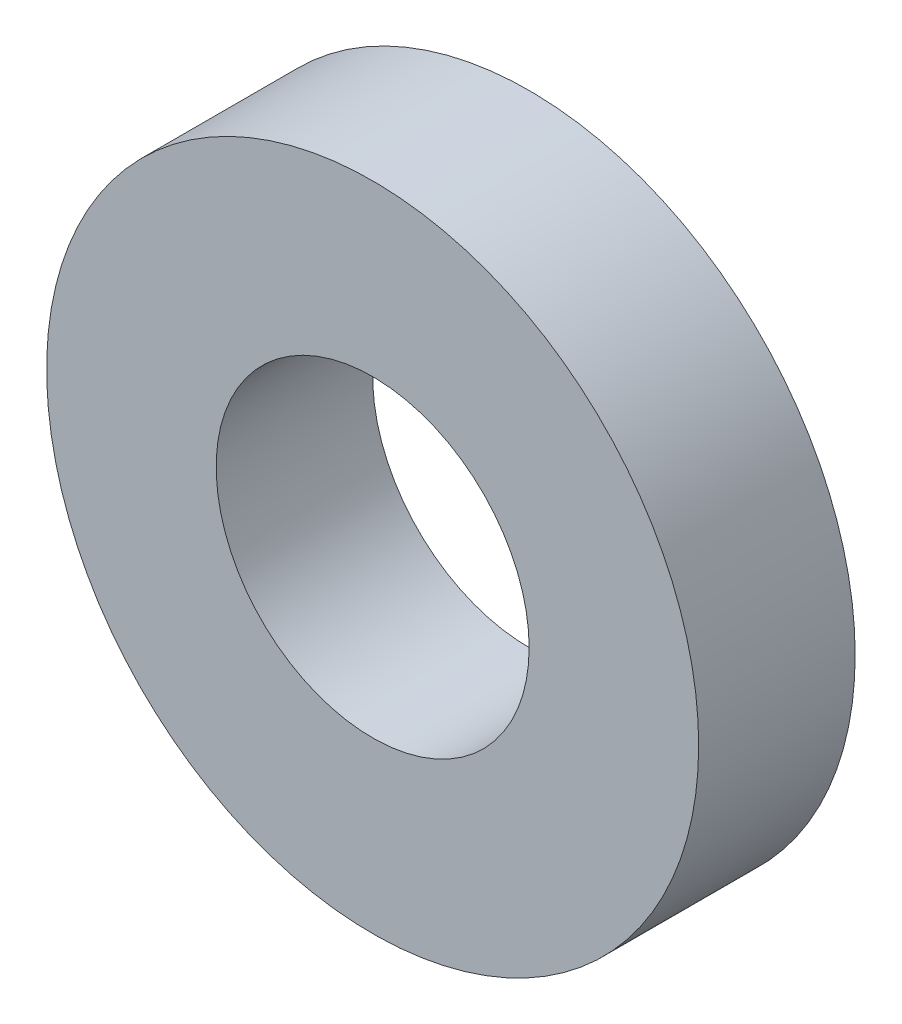
ISO-10303-21;
HEADER;
FILE_DESCRIPTION(('STEP AP214'),'2;1');
FILE_NAME('part.step','',(''),(''),'','','');
FILE_SCHEMA(('AUTOMOTIVE_DESIGN { 1 0 10303 214 1 1 1 1 }'));
ENDSEC;
DATA;
#1=APPLICATION_CONTEXT('core data for automotive mechanical design processes');
#2=APPLICATION_PROTOCOL_DEFINITION('international standard','automotive_design',2000,#1);
#3=PRODUCT_CONTEXT('',#1,'mechanical');
#4=PRODUCT('Part','Part','',(#3));
#5=PRODUCT_RELATED_PRODUCT_CATEGORY('part','',(#4));
#6=PRODUCT_DEFINITION_FORMATION('','',#4);
#7=PRODUCT_DEFINITION_CONTEXT('part definition',#1,'design');
#8=PRODUCT_DEFINITION('design','',#6,#7);
#9=PRODUCT_DEFINITION_SHAPE('','',#8);
#10=(LENGTH_UNIT() NAMED_UNIT(*) SI_UNIT(.MILLI.,.METRE.));
#11=(NAMED_UNIT(*) PLANE_ANGLE_UNIT() SI_UNIT($,.RADIAN.));
#12=(NAMED_UNIT(*) SI_UNIT($,.STERADIAN.) SOLID_ANGLE_UNIT());
#13=UNCERTAINTY_MEASURE_WITH_UNIT(LENGTH_MEASURE(1.E-05),#10,'distance_accuracy_value','');
#14=(GEOMETRIC_REPRESENTATION_CONTEXT(3) GLOBAL_UNCERTAINTY_ASSIGNED_CONTEXT((#13)) GLOBAL_UNIT_ASSIGNED_CONTEXT((#10,
#11,#12)) REPRESENTATION_CONTEXT('',''));
#15=CARTESIAN_POINT('',(0.,0.,0.));
#16=DIRECTION('',(0.,0.,1.));
#17=DIRECTION('',(1.,0.,0.));
#18=AXIS2_PLACEMENT_3D('',#15,#16,#17);
#19=CARTESIAN_POINT('',(0.,0.,6.));
#20=DIRECTION('',(0.,0.,-1.));
#21=DIRECTION('',(-1.,0.,0.));
#22=AXIS2_PLACEMENT_3D('',#19,#20,#21);
#23=CYLINDRICAL_SURFACE('',#22,12.5);
#24=CARTESIAN_POINT('',(0.,0.,6.));
#25=DIRECTION('',(0.,0.,1.));
#26=DIRECTION('',(1.,0.,0.));
#27=AXIS2_PLACEMENT_3D('',#24,#25,#26);
#28=CIRCLE('',#27,12.5);
#29=CARTESIAN_POINT('',(12.5,0.,6.));
#30=VERTEX_POINT('',#29);
#31=EDGE_CURVE('E10',#30,#30,#28,.T.);
#32=ORIENTED_EDGE('',*,*,#31,.F.);
#33=EDGE_LOOP('',(#32));
#34=FACE_BOUND('',#33,.T.);
#35=CARTESIAN_POINT('',(0.,0.,0.));
#36=DIRECTION('',(0.,0.,1.));
#37=DIRECTION('',(1.,0.,0.));
#38=AXIS2_PLACEMENT_3D('',#35,#36,#37);
#39=CIRCLE('',#38,12.5);
#40=CARTESIAN_POINT('',(12.5,0.,0.));
#41=VERTEX_POINT('',#40);
#42=EDGE_CURVE('E46',#41,#41,#39,.T.);
#43=ORIENTED_EDGE('',*,*,#42,.T.);
#44=EDGE_LOOP('',(#43));
#45=FACE_BOUND('',#44,.T.);
#46=ADVANCED_FACE('F40',(#34,#45),#23,.T.);
#47=CARTESIAN_POINT('',(0.,0.,6.));
#48=DIRECTION('',(0.,0.,1.));
#49=DIRECTION('',(1.,0.,0.));
#50=AXIS2_PLACEMENT_3D('',#47,#48,#49);
#51=PLANE('',#50);
#52=CARTESIAN_POINT('',(0.,0.,6.000012));
#53=DIRECTION('',(0.,0.,1.));
#54=DIRECTION('',(1.,0.,0.));
#55=AXIS2_PLACEMENT_3D('',#52,#53,#54);
#56=CIRCLE('',#55,6.);
#57=CARTESIAN_POINT('',(6.,0.,6.000012));
#58=VERTEX_POINT('',#57);
#59=EDGE_CURVE('E63',#58,#58,#56,.T.);
#60=ORIENTED_EDGE('',*,*,#59,.F.);
#61=EDGE_LOOP('',(#60));
#62=FACE_BOUND('',#61,.T.);
#63=ORIENTED_EDGE('',*,*,#31,.T.);
#64=EDGE_LOOP('',(#63));
#65=FACE_BOUND('',#64,.T.);
#66=ADVANCED_FACE('F64',(#62,#65),#51,.T.);
#67=CARTESIAN_POINT('',(0.,0.,0.));
#68=DIRECTION('',(0.,0.,1.));
#69=DIRECTION('',(1.,0.,0.));
#70=AXIS2_PLACEMENT_3D('',#67,#68,#69);
#71=PLANE('',#70);
#72=CARTESIAN_POINT('',(0.,0.,0.));
#73=DIRECTION('',(0.,0.,1.));
#74=DIRECTION('',(1.,0.,0.));
#75=AXIS2_PLACEMENT_3D('',#72,#73,#74);
#76=CIRCLE('',#75,6.);
#77=CARTESIAN_POINT('',(6.,0.,0.));
#78=VERTEX_POINT('',#77);
#79=EDGE_CURVE('E51',#78,#78,#76,.T.);
#80=ORIENTED_EDGE('',*,*,#79,.T.);
#81=EDGE_LOOP('',(#80));
#82=FACE_BOUND('',#81,.T.);
#83=ORIENTED_EDGE('',*,*,#42,.F.);
#84=EDGE_LOOP('',(#83));
#85=FACE_BOUND('',#84,.T.);
#86=ADVANCED_FACE('F69',(#82,#85),#71,.F.);
#87=CARTESIAN_POINT('',(0.,0.,0.));
#88=DIRECTION('',(0.,0.,1.));
#89=DIRECTION('',(1.,0.,0.));
#90=AXIS2_PLACEMENT_3D('',#87,#88,#89);
#91=CYLINDRICAL_SURFACE('',#90,6.);
#92=ORIENTED_EDGE('',*,*,#79,.F.);
#93=EDGE_LOOP('',(#92));
#94=FACE_BOUND('',#93,.T.);
#95=ORIENTED_EDGE('',*,*,#59,.T.);
#96=EDGE_LOOP('',(#95));
#97=FACE_BOUND('',#96,.T.);
#98=ADVANCED_FACE('F72',(#94,#97),#91,.F.);
#99=CLOSED_SHELL('',(#46,#66,#86,#98));
#100=MANIFOLD_SOLID_BREP('B2',#99);
#101=ADVANCED_BREP_SHAPE_REPRESENTATION('',(#18,#100),#14);
#102=SHAPE_DEFINITION_REPRESENTATION(#9,#101);
ENDSEC;
END-ISO-10303-21;
